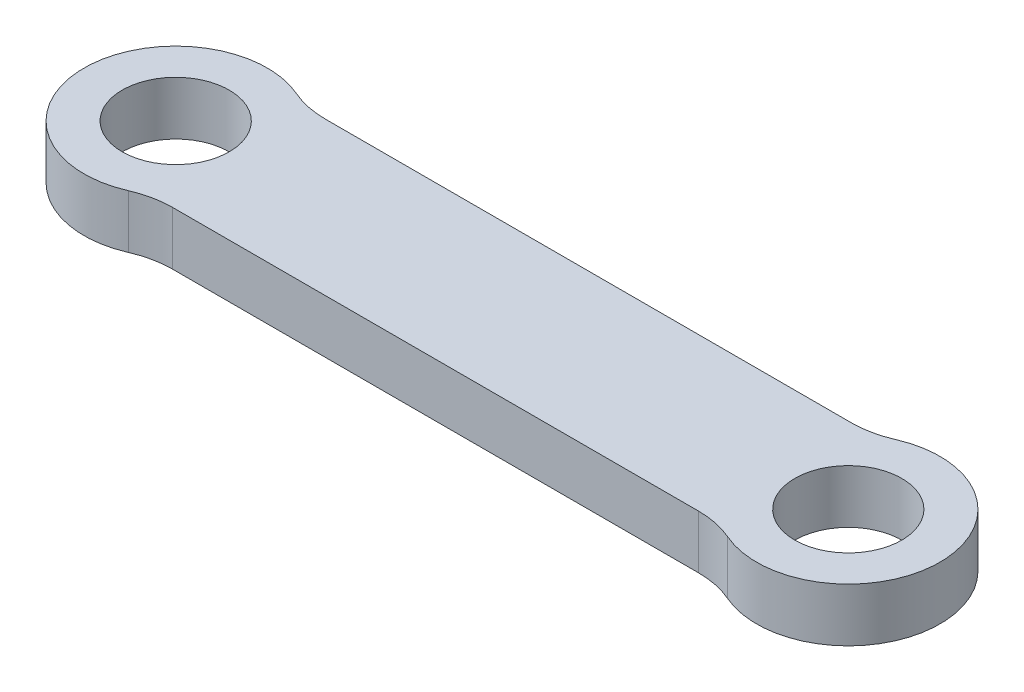
ISO-10303-21;
HEADER;
FILE_DESCRIPTION(('STEP AP214'),'2;1');
FILE_NAME('part.step','',(''),(''),'','','');
FILE_SCHEMA(('AUTOMOTIVE_DESIGN { 1 0 10303 214 1 1 1 1 }'));
ENDSEC;
DATA;
#1=APPLICATION_CONTEXT('core data for automotive mechanical design processes');
#2=APPLICATION_PROTOCOL_DEFINITION('international standard','automotive_design',2000,#1);
#3=PRODUCT_CONTEXT('',#1,'mechanical');
#4=PRODUCT('Part','Part','',(#3));
#5=PRODUCT_RELATED_PRODUCT_CATEGORY('part','',(#4));
#6=PRODUCT_DEFINITION_FORMATION('','',#4);
#7=PRODUCT_DEFINITION_CONTEXT('part definition',#1,'design');
#8=PRODUCT_DEFINITION('design','',#6,#7);
#9=PRODUCT_DEFINITION_SHAPE('','',#8);
#10=(LENGTH_UNIT() NAMED_UNIT(*) SI_UNIT(.MILLI.,.METRE.));
#11=(NAMED_UNIT(*) PLANE_ANGLE_UNIT() SI_UNIT($,.RADIAN.));
#12=(NAMED_UNIT(*) SI_UNIT($,.STERADIAN.) SOLID_ANGLE_UNIT());
#13=UNCERTAINTY_MEASURE_WITH_UNIT(LENGTH_MEASURE(1.E-05),#10,'distance_accuracy_value','');
#14=(GEOMETRIC_REPRESENTATION_CONTEXT(3) GLOBAL_UNCERTAINTY_ASSIGNED_CONTEXT((#13)) GLOBAL_UNIT_ASSIGNED_CONTEXT((#10,
#11,#12)) REPRESENTATION_CONTEXT('',''));
#15=CARTESIAN_POINT('',(0.,0.,0.));
#16=DIRECTION('',(0.,0.,1.));
#17=DIRECTION('',(1.,0.,0.));
#18=AXIS2_PLACEMENT_3D('',#15,#16,#17);
#19=CARTESIAN_POINT('',(22.,1.75,0.));
#20=DIRECTION('',(0.,-1.,0.));
#21=DIRECTION('',(0.,0.,-1.));
#22=AXIS2_PLACEMENT_3D('',#19,#20,#21);
#23=CYLINDRICAL_SURFACE('',#22,3.);
#24=CARTESIAN_POINT('',(22.,1.75,0.));
#25=DIRECTION('',(0.,1.,0.));
#26=DIRECTION('',(0.,0.,1.));
#27=AXIS2_PLACEMENT_3D('',#24,#25,#26);
#28=CIRCLE('',#27,3.);
#29=CARTESIAN_POINT('',(20.8010421191718,1.75,2.75));
#30=VERTEX_POINT('',#29);
#31=CARTESIAN_POINT('',(20.8010421191718,1.75,-2.75));
#32=VERTEX_POINT('',#31);
#33=EDGE_CURVE('E156',#30,#32,#28,.T.);
#34=ORIENTED_EDGE('',*,*,#33,.F.);
#35=DIRECTION('',(0.,-1.,0.));
#36=VECTOR('',#35,1.);
#37=CARTESIAN_POINT('',(20.8010421191718,1.75,2.75));
#38=LINE('',#37,#36);
#39=CARTESIAN_POINT('',(20.8010421191718,0.,2.75));
#40=VERTEX_POINT('',#39);
#41=EDGE_CURVE('E168',#30,#40,#38,.T.);
#42=ORIENTED_EDGE('',*,*,#41,.T.);
#43=CARTESIAN_POINT('',(22.,0.,0.));
#44=DIRECTION('',(0.,1.,0.));
#45=DIRECTION('',(0.,0.,1.));
#46=AXIS2_PLACEMENT_3D('',#43,#44,#45);
#47=CIRCLE('',#46,3.);
#48=CARTESIAN_POINT('',(20.8010421191718,0.,-2.75));
#49=VERTEX_POINT('',#48);
#50=EDGE_CURVE('E195',#40,#49,#47,.T.);
#51=ORIENTED_EDGE('',*,*,#50,.T.);
#52=DIRECTION('',(0.,-1.,0.));
#53=VECTOR('',#52,1.);
#54=CARTESIAN_POINT('',(20.8010421191718,1.75,-2.75));
#55=LINE('',#54,#53);
#56=EDGE_CURVE('E165',#49,#32,#55,.F.);
#57=ORIENTED_EDGE('',*,*,#56,.T.);
#58=EDGE_LOOP('',(#34,#42,#51,#57));
#59=FACE_BOUND('',#58,.T.);
#60=ADVANCED_FACE('F43',(#59),#23,.T.);
#61=CARTESIAN_POINT('',(0.,1.75,-2.5));
#62=DIRECTION('',(0.,0.,-1.));
#63=DIRECTION('',(-1.,0.,0.));
#64=AXIS2_PLACEMENT_3D('',#61,#62,#63);
#65=PLANE('',#64);
#66=DIRECTION('',(1.,0.,0.));
#67=VECTOR('',#66,1.);
#68=CARTESIAN_POINT('',(0.,1.75,-2.5));
#69=LINE('',#68,#67);
#70=CARTESIAN_POINT('',(2.39791576165636,1.75,-2.5));
#71=VERTEX_POINT('',#70);
#72=CARTESIAN_POINT('',(19.6020842383436,1.75,-2.5));
#73=VERTEX_POINT('',#72);
#74=EDGE_CURVE('E202',#71,#73,#69,.T.);
#75=ORIENTED_EDGE('',*,*,#74,.T.);
#76=DIRECTION('',(0.,-1.,0.));
#77=VECTOR('',#76,1.);
#78=CARTESIAN_POINT('',(19.6020842383436,1.75,-2.5));
#79=LINE('',#78,#77);
#80=CARTESIAN_POINT('',(19.6020842383436,0.,-2.5));
#81=VERTEX_POINT('',#80);
#82=EDGE_CURVE('E122',#73,#81,#79,.T.);
#83=ORIENTED_EDGE('',*,*,#82,.T.);
#84=DIRECTION('',(1.,0.,0.));
#85=VECTOR('',#84,1.);
#86=CARTESIAN_POINT('',(0.,0.,-2.5));
#87=LINE('',#86,#85);
#88=CARTESIAN_POINT('',(2.39791576165636,0.,-2.5));
#89=VERTEX_POINT('',#88);
#90=EDGE_CURVE('E149',#89,#81,#87,.T.);
#91=ORIENTED_EDGE('',*,*,#90,.F.);
#92=DIRECTION('',(0.,-1.,0.));
#93=VECTOR('',#92,1.);
#94=CARTESIAN_POINT('',(2.39791576165636,1.75,-2.5));
#95=LINE('',#94,#93);
#96=EDGE_CURVE('E66',#89,#71,#95,.F.);
#97=ORIENTED_EDGE('',*,*,#96,.T.);
#98=EDGE_LOOP('',(#75,#83,#91,#97));
#99=FACE_BOUND('',#98,.T.);
#100=ADVANCED_FACE('F192',(#99),#65,.T.);
#101=CARTESIAN_POINT('',(0.,1.75,0.));
#102=DIRECTION('',(0.,-1.,0.));
#103=DIRECTION('',(0.,0.,-1.));
#104=AXIS2_PLACEMENT_3D('',#101,#102,#103);
#105=CYLINDRICAL_SURFACE('',#104,3.);
#106=CARTESIAN_POINT('',(0.,0.,0.));
#107=DIRECTION('',(0.,1.,0.));
#108=DIRECTION('',(0.,0.,1.));
#109=AXIS2_PLACEMENT_3D('',#106,#107,#108);
#110=CIRCLE('',#109,3.);
#111=CARTESIAN_POINT('',(1.19895788082818,0.,-2.75));
#112=VERTEX_POINT('',#111);
#113=CARTESIAN_POINT('',(1.19895788082818,0.,2.75));
#114=VERTEX_POINT('',#113);
#115=EDGE_CURVE('E142',#112,#114,#110,.T.);
#116=ORIENTED_EDGE('',*,*,#115,.T.);
#117=DIRECTION('',(0.,-1.,0.));
#118=VECTOR('',#117,1.);
#119=CARTESIAN_POINT('',(1.19895788082818,1.75,2.75));
#120=LINE('',#119,#118);
#121=CARTESIAN_POINT('',(1.19895788082818,1.75,2.75));
#122=VERTEX_POINT('',#121);
#123=EDGE_CURVE('E115',#114,#122,#120,.F.);
#124=ORIENTED_EDGE('',*,*,#123,.T.);
#125=CARTESIAN_POINT('',(0.,1.75,0.));
#126=DIRECTION('',(0.,1.,0.));
#127=DIRECTION('',(0.,0.,1.));
#128=AXIS2_PLACEMENT_3D('',#125,#126,#127);
#129=CIRCLE('',#128,3.);
#130=CARTESIAN_POINT('',(1.19895788082818,1.75,-2.75));
#131=VERTEX_POINT('',#130);
#132=EDGE_CURVE('E201',#131,#122,#129,.T.);
#133=ORIENTED_EDGE('',*,*,#132,.F.);
#134=DIRECTION('',(0.,-1.,0.));
#135=VECTOR('',#134,1.);
#136=CARTESIAN_POINT('',(1.19895788082818,1.75,-2.75));
#137=LINE('',#136,#135);
#138=EDGE_CURVE('E133',#131,#112,#137,.T.);
#139=ORIENTED_EDGE('',*,*,#138,.T.);
#140=EDGE_LOOP('',(#116,#124,#133,#139));
#141=FACE_BOUND('',#140,.T.);
#142=ADVANCED_FACE('F204',(#141),#105,.T.);
#143=CARTESIAN_POINT('',(0.,1.75,0.));
#144=DIRECTION('',(0.,-1.,0.));
#145=DIRECTION('',(0.,0.,-1.));
#146=AXIS2_PLACEMENT_3D('',#143,#144,#145);
#147=CYLINDRICAL_SURFACE('',#146,1.75);
#148=CARTESIAN_POINT('',(0.,1.75,0.));
#149=DIRECTION('',(0.,1.,0.));
#150=DIRECTION('',(0.,0.,1.));
#151=AXIS2_PLACEMENT_3D('',#148,#149,#150);
#152=CIRCLE('',#151,1.75);
#153=CARTESIAN_POINT('',(0.,1.75,1.75));
#154=VERTEX_POINT('',#153);
#155=EDGE_CURVE('E209',#154,#154,#152,.T.);
#156=ORIENTED_EDGE('',*,*,#155,.T.);
#157=EDGE_LOOP('',(#156));
#158=FACE_BOUND('',#157,.T.);
#159=CARTESIAN_POINT('',(0.,0.,0.));
#160=DIRECTION('',(0.,1.,0.));
#161=DIRECTION('',(0.,0.,1.));
#162=AXIS2_PLACEMENT_3D('',#159,#160,#161);
#163=CIRCLE('',#162,1.75);
#164=CARTESIAN_POINT('',(0.,0.,1.75));
#165=VERTEX_POINT('',#164);
#166=EDGE_CURVE('E141',#165,#165,#163,.T.);
#167=ORIENTED_EDGE('',*,*,#166,.F.);
#168=EDGE_LOOP('',(#167));
#169=FACE_BOUND('',#168,.T.);
#170=ADVANCED_FACE('F258',(#158,#169),#147,.F.);
#171=CARTESIAN_POINT('',(0.,1.75,2.5));
#172=DIRECTION('',(0.,0.,-1.));
#173=DIRECTION('',(-1.,0.,0.));
#174=AXIS2_PLACEMENT_3D('',#171,#172,#173);
#175=PLANE('',#174);
#176=DIRECTION('',(1.,0.,0.));
#177=VECTOR('',#176,1.);
#178=CARTESIAN_POINT('',(0.,1.75,2.5));
#179=LINE('',#178,#177);
#180=CARTESIAN_POINT('',(2.39791576165636,1.75,2.5));
#181=VERTEX_POINT('',#180);
#182=CARTESIAN_POINT('',(19.6020842383436,1.75,2.5));
#183=VERTEX_POINT('',#182);
#184=EDGE_CURVE('E131',#181,#183,#179,.T.);
#185=ORIENTED_EDGE('',*,*,#184,.F.);
#186=DIRECTION('',(0.,1.,0.));
#187=VECTOR('',#186,1.);
#188=CARTESIAN_POINT('',(2.39791576165636,0.,2.5));
#189=LINE('',#188,#187);
#190=CARTESIAN_POINT('',(2.39791576165636,0.,2.5));
#191=VERTEX_POINT('',#190);
#192=EDGE_CURVE('E114',#181,#191,#189,.F.);
#193=ORIENTED_EDGE('',*,*,#192,.T.);
#194=DIRECTION('',(1.,0.,0.));
#195=VECTOR('',#194,1.);
#196=CARTESIAN_POINT('',(0.,0.,2.5));
#197=LINE('',#196,#195);
#198=CARTESIAN_POINT('',(19.6020842383436,0.,2.5));
#199=VERTEX_POINT('',#198);
#200=EDGE_CURVE('E128',#191,#199,#197,.T.);
#201=ORIENTED_EDGE('',*,*,#200,.T.);
#202=DIRECTION('',(0.,1.,0.));
#203=VECTOR('',#202,1.);
#204=CARTESIAN_POINT('',(19.6020842383436,1.75,2.5));
#205=LINE('',#204,#203);
#206=EDGE_CURVE('E134',#199,#183,#205,.T.);
#207=ORIENTED_EDGE('',*,*,#206,.T.);
#208=EDGE_LOOP('',(#185,#193,#201,#207));
#209=FACE_BOUND('',#208,.T.);
#210=ADVANCED_FACE('F127',(#209),#175,.F.);
#211=CARTESIAN_POINT('',(22.,1.75,0.));
#212=DIRECTION('',(0.,-1.,0.));
#213=DIRECTION('',(0.,0.,-1.));
#214=AXIS2_PLACEMENT_3D('',#211,#212,#213);
#215=CYLINDRICAL_SURFACE('',#214,1.75);
#216=CARTESIAN_POINT('',(22.,1.75,0.));
#217=DIRECTION('',(0.,1.,0.));
#218=DIRECTION('',(0.,0.,1.));
#219=AXIS2_PLACEMENT_3D('',#216,#217,#218);
#220=CIRCLE('',#219,1.75);
#221=CARTESIAN_POINT('',(22.,1.75,1.75));
#222=VERTEX_POINT('',#221);
#223=EDGE_CURVE('E158',#222,#222,#220,.T.);
#224=ORIENTED_EDGE('',*,*,#223,.T.);
#225=EDGE_LOOP('',(#224));
#226=FACE_BOUND('',#225,.T.);
#227=CARTESIAN_POINT('',(22.,0.,0.));
#228=DIRECTION('',(0.,1.,0.));
#229=DIRECTION('',(0.,0.,1.));
#230=AXIS2_PLACEMENT_3D('',#227,#228,#229);
#231=CIRCLE('',#230,1.75);
#232=CARTESIAN_POINT('',(22.,0.,1.75));
#233=VERTEX_POINT('',#232);
#234=EDGE_CURVE('E147',#233,#233,#231,.T.);
#235=ORIENTED_EDGE('',*,*,#234,.F.);
#236=EDGE_LOOP('',(#235));
#237=FACE_BOUND('',#236,.T.);
#238=ADVANCED_FACE('F252',(#226,#237),#215,.F.);
#239=CARTESIAN_POINT('',(0.,1.75,0.));
#240=DIRECTION('',(0.,1.,0.));
#241=DIRECTION('',(0.,0.,1.));
#242=AXIS2_PLACEMENT_3D('',#239,#240,#241);
#243=PLANE('',#242);
#244=ORIENTED_EDGE('',*,*,#184,.T.);
#245=CARTESIAN_POINT('',(19.6020842383436,1.75,5.5));
#246=DIRECTION('',(0.,1.,0.));
#247=DIRECTION('',(0.,0.,1.));
#248=AXIS2_PLACEMENT_3D('',#245,#246,#247);
#249=CIRCLE('',#248,3.);
#250=EDGE_CURVE('E181',#183,#30,#249,.F.);
#251=ORIENTED_EDGE('',*,*,#250,.T.);
#252=ORIENTED_EDGE('',*,*,#33,.T.);
#253=CARTESIAN_POINT('',(19.6020842383436,1.75,-5.5));
#254=DIRECTION('',(0.,1.,0.));
#255=DIRECTION('',(0.,0.,1.));
#256=AXIS2_PLACEMENT_3D('',#253,#254,#255);
#257=CIRCLE('',#256,3.);
#258=EDGE_CURVE('E59',#32,#73,#257,.F.);
#259=ORIENTED_EDGE('',*,*,#258,.T.);
#260=ORIENTED_EDGE('',*,*,#74,.F.);
#261=CARTESIAN_POINT('',(2.39791576165636,1.75,-5.5));
#262=DIRECTION('',(0.,1.,0.));
#263=DIRECTION('',(0.,0.,1.));
#264=AXIS2_PLACEMENT_3D('',#261,#262,#263);
#265=CIRCLE('',#264,3.);
#266=EDGE_CURVE('E11',#71,#131,#265,.F.);
#267=ORIENTED_EDGE('',*,*,#266,.T.);
#268=ORIENTED_EDGE('',*,*,#132,.T.);
#269=CARTESIAN_POINT('',(2.39791576165636,1.75,5.5));
#270=DIRECTION('',(0.,1.,0.));
#271=DIRECTION('',(0.,0.,1.));
#272=AXIS2_PLACEMENT_3D('',#269,#270,#271);
#273=CIRCLE('',#272,3.);
#274=EDGE_CURVE('E121',#122,#181,#273,.F.);
#275=ORIENTED_EDGE('',*,*,#274,.T.);
#276=EDGE_LOOP('',(#244,#251,#252,#259,#260,#267,#268,#275));
#277=FACE_BOUND('',#276,.T.);
#278=ORIENTED_EDGE('',*,*,#155,.F.);
#279=EDGE_LOOP('',(#278));
#280=FACE_BOUND('',#279,.T.);
#281=ORIENTED_EDGE('',*,*,#223,.F.);
#282=EDGE_LOOP('',(#281));
#283=FACE_BOUND('',#282,.T.);
#284=ADVANCED_FACE('F199',(#277,#280,#283),#243,.T.);
#285=CARTESIAN_POINT('',(0.,0.,0.));
#286=DIRECTION('',(0.,1.,0.));
#287=DIRECTION('',(0.,0.,1.));
#288=AXIS2_PLACEMENT_3D('',#285,#286,#287);
#289=PLANE('',#288);
#290=ORIENTED_EDGE('',*,*,#50,.F.);
#291=CARTESIAN_POINT('',(19.6020842383436,0.,5.5));
#292=DIRECTION('',(0.,1.,0.));
#293=DIRECTION('',(0.,0.,1.));
#294=AXIS2_PLACEMENT_3D('',#291,#292,#293);
#295=CIRCLE('',#294,3.);
#296=EDGE_CURVE('E139',#40,#199,#295,.T.);
#297=ORIENTED_EDGE('',*,*,#296,.T.);
#298=ORIENTED_EDGE('',*,*,#200,.F.);
#299=CARTESIAN_POINT('',(2.39791576165636,0.,5.5));
#300=DIRECTION('',(0.,1.,0.));
#301=DIRECTION('',(0.,0.,1.));
#302=AXIS2_PLACEMENT_3D('',#299,#300,#301);
#303=CIRCLE('',#302,3.);
#304=EDGE_CURVE('E110',#191,#114,#303,.T.);
#305=ORIENTED_EDGE('',*,*,#304,.T.);
#306=ORIENTED_EDGE('',*,*,#115,.F.);
#307=CARTESIAN_POINT('',(2.39791576165636,0.,-5.5));
#308=DIRECTION('',(0.,1.,0.));
#309=DIRECTION('',(0.,0.,1.));
#310=AXIS2_PLACEMENT_3D('',#307,#308,#309);
#311=CIRCLE('',#310,3.);
#312=EDGE_CURVE('E52',#112,#89,#311,.T.);
#313=ORIENTED_EDGE('',*,*,#312,.T.);
#314=ORIENTED_EDGE('',*,*,#90,.T.);
#315=CARTESIAN_POINT('',(19.6020842383436,0.,-5.5));
#316=DIRECTION('',(0.,1.,0.));
#317=DIRECTION('',(0.,0.,1.));
#318=AXIS2_PLACEMENT_3D('',#315,#316,#317);
#319=CIRCLE('',#318,3.);
#320=EDGE_CURVE('E184',#81,#49,#319,.T.);
#321=ORIENTED_EDGE('',*,*,#320,.T.);
#322=EDGE_LOOP('',(#290,#297,#298,#305,#306,#313,#314,#321));
#323=FACE_BOUND('',#322,.T.);
#324=ORIENTED_EDGE('',*,*,#166,.T.);
#325=EDGE_LOOP('',(#324));
#326=FACE_BOUND('',#325,.T.);
#327=ORIENTED_EDGE('',*,*,#234,.T.);
#328=EDGE_LOOP('',(#327));
#329=FACE_BOUND('',#328,.T.);
#330=ADVANCED_FACE('F137',(#323,#326,#329),#289,.F.);
#331=CARTESIAN_POINT('',(2.39791576165636,1.75,5.5));
#332=DIRECTION('',(0.,-1.,0.));
#333=DIRECTION('',(0.,0.,-1.));
#334=AXIS2_PLACEMENT_3D('',#331,#332,#333);
#335=CYLINDRICAL_SURFACE('',#334,3.);
#336=ORIENTED_EDGE('',*,*,#274,.F.);
#337=ORIENTED_EDGE('',*,*,#123,.F.);
#338=ORIENTED_EDGE('',*,*,#304,.F.);
#339=ORIENTED_EDGE('',*,*,#192,.F.);
#340=EDGE_LOOP('',(#336,#337,#338,#339));
#341=FACE_BOUND('',#340,.T.);
#342=ADVANCED_FACE('F113',(#341),#335,.F.);
#343=CARTESIAN_POINT('',(19.6020842383436,1.75,5.5));
#344=DIRECTION('',(0.,-1.,0.));
#345=DIRECTION('',(0.,0.,-1.));
#346=AXIS2_PLACEMENT_3D('',#343,#344,#345);
#347=CYLINDRICAL_SURFACE('',#346,3.);
#348=ORIENTED_EDGE('',*,*,#250,.F.);
#349=ORIENTED_EDGE('',*,*,#206,.F.);
#350=ORIENTED_EDGE('',*,*,#296,.F.);
#351=ORIENTED_EDGE('',*,*,#41,.F.);
#352=EDGE_LOOP('',(#348,#349,#350,#351));
#353=FACE_BOUND('',#352,.T.);
#354=ADVANCED_FACE('F229',(#353),#347,.F.);
#355=CARTESIAN_POINT('',(19.6020842383436,1.75,-5.5));
#356=DIRECTION('',(0.,-1.,0.));
#357=DIRECTION('',(0.,0.,-1.));
#358=AXIS2_PLACEMENT_3D('',#355,#356,#357);
#359=CYLINDRICAL_SURFACE('',#358,3.);
#360=ORIENTED_EDGE('',*,*,#258,.F.);
#361=ORIENTED_EDGE('',*,*,#56,.F.);
#362=ORIENTED_EDGE('',*,*,#320,.F.);
#363=ORIENTED_EDGE('',*,*,#82,.F.);
#364=EDGE_LOOP('',(#360,#361,#362,#363));
#365=FACE_BOUND('',#364,.T.);
#366=ADVANCED_FACE('F227',(#365),#359,.F.);
#367=CARTESIAN_POINT('',(2.39791576165636,1.75,-5.5));
#368=DIRECTION('',(0.,-1.,0.));
#369=DIRECTION('',(0.,0.,-1.));
#370=AXIS2_PLACEMENT_3D('',#367,#368,#369);
#371=CYLINDRICAL_SURFACE('',#370,3.);
#372=ORIENTED_EDGE('',*,*,#266,.F.);
#373=ORIENTED_EDGE('',*,*,#96,.F.);
#374=ORIENTED_EDGE('',*,*,#312,.F.);
#375=ORIENTED_EDGE('',*,*,#138,.F.);
#376=EDGE_LOOP('',(#372,#373,#374,#375));
#377=FACE_BOUND('',#376,.T.);
#378=ADVANCED_FACE('F45',(#377),#371,.F.);
#379=CLOSED_SHELL('',(#60,#100,#142,#170,#210,#238,#284,#330,#342,#354,#366,#378));
#380=MANIFOLD_SOLID_BREP('B2',#379);
#381=ADVANCED_BREP_SHAPE_REPRESENTATION('',(#18,#380),#14);
#382=SHAPE_DEFINITION_REPRESENTATION(#9,#381);
ENDSEC;
END-ISO-10303-21;
